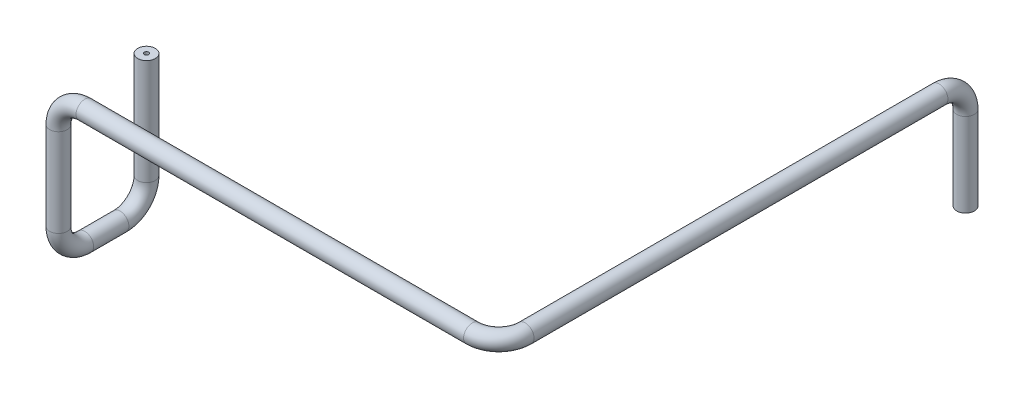
ISO-10303-21;
HEADER;
FILE_DESCRIPTION(('STEP AP214'),'2;1');
FILE_NAME('part.step','',(''),(''),'','','');
FILE_SCHEMA(('AUTOMOTIVE_DESIGN { 1 0 10303 214 1 1 1 1 }'));
ENDSEC;
DATA;
#1=APPLICATION_CONTEXT('core data for automotive mechanical design processes');
#2=APPLICATION_PROTOCOL_DEFINITION('international standard','automotive_design',2000,#1);
#3=PRODUCT_CONTEXT('',#1,'mechanical');
#4=PRODUCT('Part','Part','',(#3));
#5=PRODUCT_RELATED_PRODUCT_CATEGORY('part','',(#4));
#6=PRODUCT_DEFINITION_FORMATION('','',#4);
#7=PRODUCT_DEFINITION_CONTEXT('part definition',#1,'design');
#8=PRODUCT_DEFINITION('design','',#6,#7);
#9=PRODUCT_DEFINITION_SHAPE('','',#8);
#10=(LENGTH_UNIT() NAMED_UNIT(*) SI_UNIT(.MILLI.,.METRE.));
#11=(NAMED_UNIT(*) PLANE_ANGLE_UNIT() SI_UNIT($,.RADIAN.));
#12=(NAMED_UNIT(*) SI_UNIT($,.STERADIAN.) SOLID_ANGLE_UNIT());
#13=UNCERTAINTY_MEASURE_WITH_UNIT(LENGTH_MEASURE(1.E-05),#10,'distance_accuracy_value','');
#14=(GEOMETRIC_REPRESENTATION_CONTEXT(3) GLOBAL_UNCERTAINTY_ASSIGNED_CONTEXT((#13)) GLOBAL_UNIT_ASSIGNED_CONTEXT((#10,
#11,#12)) REPRESENTATION_CONTEXT('',''));
#15=CARTESIAN_POINT('',(0.,0.,0.));
#16=DIRECTION('',(0.,0.,1.));
#17=DIRECTION('',(1.,0.,0.));
#18=AXIS2_PLACEMENT_3D('',#15,#16,#17);
#19=CARTESIAN_POINT('',(20.,402.,236.));
#20=DIRECTION('',(0.,1.,0.));
#21=DIRECTION('',(1.,0.,0.));
#22=AXIS2_PLACEMENT_3D('',#19,#20,#21);
#23=PLANE('',#22);
#24=CARTESIAN_POINT('',(20.,402.,236.));
#25=DIRECTION('',(0.,1.,0.));
#26=DIRECTION('',(1.,0.,0.));
#27=AXIS2_PLACEMENT_3D('',#24,#25,#26);
#28=CIRCLE('',#27,0.5);
#29=CARTESIAN_POINT('',(20.5,402.,236.));
#30=VERTEX_POINT('',#29);
#31=EDGE_CURVE('E361',#30,#30,#28,.T.);
#32=ORIENTED_EDGE('',*,*,#31,.F.);
#33=EDGE_LOOP('',(#32));
#34=FACE_BOUND('',#33,.T.);
#35=CARTESIAN_POINT('',(20.,402.,236.));
#36=DIRECTION('',(0.,1.,0.));
#37=DIRECTION('',(0.,0.,1.));
#38=AXIS2_PLACEMENT_3D('',#35,#36,#37);
#39=CIRCLE('',#38,2.);
#40=CARTESIAN_POINT('',(20.,402.,238.));
#41=VERTEX_POINT('',#40);
#42=EDGE_CURVE('E75',#41,#41,#39,.T.);
#43=ORIENTED_EDGE('',*,*,#42,.T.);
#44=EDGE_LOOP('',(#43));
#45=FACE_BOUND('',#44,.T.);
#46=ADVANCED_FACE('F52',(#34,#45),#23,.T.);
#47=CARTESIAN_POINT('',(120.,379.,150.));
#48=DIRECTION('',(0.,1.,0.));
#49=DIRECTION('',(0.,0.,1.));
#50=AXIS2_PLACEMENT_3D('',#47,#48,#49);
#51=PLANE('',#50);
#52=CARTESIAN_POINT('',(120.,379.,150.));
#53=DIRECTION('',(0.,1.,0.));
#54=DIRECTION('',(0.,0.,1.));
#55=AXIS2_PLACEMENT_3D('',#52,#53,#54);
#56=CIRCLE('',#55,0.5);
#57=CARTESIAN_POINT('',(120.,379.,150.5));
#58=VERTEX_POINT('',#57);
#59=EDGE_CURVE('E73',#58,#58,#56,.T.);
#60=ORIENTED_EDGE('',*,*,#59,.T.);
#61=EDGE_LOOP('',(#60));
#62=FACE_BOUND('',#61,.T.);
#63=CARTESIAN_POINT('',(120.,379.,150.));
#64=DIRECTION('',(0.,1.,0.));
#65=DIRECTION('',(0.,0.,1.));
#66=AXIS2_PLACEMENT_3D('',#63,#64,#65);
#67=CIRCLE('',#66,2.);
#68=CARTESIAN_POINT('',(120.,379.,152.));
#69=VERTEX_POINT('',#68);
#70=EDGE_CURVE('E11',#69,#69,#67,.T.);
#71=ORIENTED_EDGE('',*,*,#70,.F.);
#72=EDGE_LOOP('',(#71));
#73=FACE_BOUND('',#72,.T.);
#74=ADVANCED_FACE('F180',(#62,#73),#51,.F.);
#75=CARTESIAN_POINT('',(20.,402.,236.));
#76=DIRECTION('',(0.,-1.,0.));
#77=DIRECTION('',(0.,0.,-1.));
#78=AXIS2_PLACEMENT_3D('',#75,#76,#77);
#79=CYLINDRICAL_SURFACE('',#78,2.);
#80=CARTESIAN_POINT('',(20.,378.,236.));
#81=DIRECTION('',(0.,-1.,0.));
#82=DIRECTION('',(0.,0.,-1.));
#83=AXIS2_PLACEMENT_3D('',#80,#81,#82);
#84=CIRCLE('',#83,2.);
#85=CARTESIAN_POINT('',(20.,378.,234.));
#86=VERTEX_POINT('',#85);
#87=EDGE_CURVE('E74',#86,#86,#84,.F.);
#88=ORIENTED_EDGE('',*,*,#87,.T.);
#89=EDGE_LOOP('',(#88));
#90=FACE_BOUND('',#89,.T.);
#91=ORIENTED_EDGE('',*,*,#42,.F.);
#92=EDGE_LOOP('',(#91));
#93=FACE_BOUND('',#92,.T.);
#94=ADVANCED_FACE('F179',(#90,#93),#79,.T.);
#95=CARTESIAN_POINT('',(20.,378.,242.));
#96=DIRECTION('',(-1.,0.,0.));
#97=DIRECTION('',(0.,0.,1.));
#98=AXIS2_PLACEMENT_3D('',#95,#96,#97);
#99=TOROIDAL_SURFACE('',#98,5.99999999999998,2.);
#100=CARTESIAN_POINT('',(20.,372.,242.));
#101=DIRECTION('',(0.,0.,-1.));
#102=DIRECTION('',(0.,1.,0.));
#103=AXIS2_PLACEMENT_3D('',#100,#101,#102);
#104=CIRCLE('',#103,2.);
#105=CARTESIAN_POINT('',(20.,370.,242.));
#106=VERTEX_POINT('',#105);
#107=EDGE_CURVE('E78',#106,#106,#104,.T.);
#108=CARTESIAN_POINT('',(20.,378.,242.));
#109=DIRECTION('',(-1.,0.,0.));
#110=DIRECTION('',(0.,0.,1.));
#111=AXIS2_PLACEMENT_3D('',#108,#109,#110);
#112=CIRCLE('',#111,7.99999999999998);
#113=EDGE_CURVE('',#86,#106,#112,.T.);
#114=ORIENTED_EDGE('',*,*,#87,.F.);
#115=ORIENTED_EDGE('',*,*,#107,.T.);
#116=ORIENTED_EDGE('',*,*,#113,.T.);
#117=ORIENTED_EDGE('',*,*,#113,.F.);
#118=EDGE_LOOP('',(#114,#116,#115,#117));
#119=FACE_BOUND('',#118,.T.);
#120=ADVANCED_FACE('F189',(#119),#99,.T.);
#121=CARTESIAN_POINT('',(20.,372.,242.));
#122=DIRECTION('',(0.,0.,1.));
#123=DIRECTION('',(1.,0.,0.));
#124=AXIS2_PLACEMENT_3D('',#121,#122,#123);
#125=CYLINDRICAL_SURFACE('',#124,2.);
#126=CARTESIAN_POINT('',(20.,372.,250.));
#127=DIRECTION('',(0.,0.,1.));
#128=DIRECTION('',(1.,0.,0.));
#129=AXIS2_PLACEMENT_3D('',#126,#127,#128);
#130=CIRCLE('',#129,2.);
#131=CARTESIAN_POINT('',(20.,370.,250.));
#132=VERTEX_POINT('',#131);
#133=EDGE_CURVE('E91',#132,#132,#130,.F.);
#134=ORIENTED_EDGE('',*,*,#133,.T.);
#135=EDGE_LOOP('',(#134));
#136=FACE_BOUND('',#135,.T.);
#137=ORIENTED_EDGE('',*,*,#107,.F.);
#138=EDGE_LOOP('',(#137));
#139=FACE_BOUND('',#138,.T.);
#140=ADVANCED_FACE('F187',(#136,#139),#125,.T.);
#141=CARTESIAN_POINT('',(20.,378.,250.));
#142=DIRECTION('',(-1.,0.,0.));
#143=DIRECTION('',(0.,0.,1.));
#144=AXIS2_PLACEMENT_3D('',#141,#142,#143);
#145=TOROIDAL_SURFACE('',#144,6.00000000000001,2.);
#146=CARTESIAN_POINT('',(20.,378.,256.));
#147=DIRECTION('',(0.,-1.,0.));
#148=DIRECTION('',(0.,0.,-1.));
#149=AXIS2_PLACEMENT_3D('',#146,#147,#148);
#150=CIRCLE('',#149,2.);
#151=CARTESIAN_POINT('',(20.,378.,258.));
#152=VERTEX_POINT('',#151);
#153=EDGE_CURVE('E96',#152,#152,#150,.T.);
#154=CARTESIAN_POINT('',(20.,378.,250.));
#155=DIRECTION('',(-1.,0.,0.));
#156=DIRECTION('',(0.,0.,1.));
#157=AXIS2_PLACEMENT_3D('',#154,#155,#156);
#158=CIRCLE('',#157,8.00000000000001);
#159=EDGE_CURVE('',#132,#152,#158,.T.);
#160=ORIENTED_EDGE('',*,*,#133,.F.);
#161=ORIENTED_EDGE('',*,*,#153,.T.);
#162=ORIENTED_EDGE('',*,*,#159,.T.);
#163=ORIENTED_EDGE('',*,*,#159,.F.);
#164=EDGE_LOOP('',(#160,#162,#161,#163));
#165=FACE_BOUND('',#164,.T.);
#166=ADVANCED_FACE('F193',(#165),#145,.T.);
#167=CARTESIAN_POINT('',(20.,378.,256.));
#168=DIRECTION('',(0.,1.,0.));
#169=DIRECTION('',(0.,0.,1.));
#170=AXIS2_PLACEMENT_3D('',#167,#168,#169);
#171=CYLINDRICAL_SURFACE('',#170,2.);
#172=CARTESIAN_POINT('',(20.,398.,256.));
#173=DIRECTION('',(0.,1.,0.));
#174=DIRECTION('',(0.,0.,1.));
#175=AXIS2_PLACEMENT_3D('',#172,#173,#174);
#176=CIRCLE('',#175,2.);
#177=CARTESIAN_POINT('',(18.,398.,256.));
#178=VERTEX_POINT('',#177);
#179=EDGE_CURVE('E97',#178,#178,#176,.F.);
#180=ORIENTED_EDGE('',*,*,#179,.T.);
#181=EDGE_LOOP('',(#180));
#182=FACE_BOUND('',#181,.T.);
#183=ORIENTED_EDGE('',*,*,#153,.F.);
#184=EDGE_LOOP('',(#183));
#185=FACE_BOUND('',#184,.T.);
#186=ADVANCED_FACE('F196',(#182,#185),#171,.T.);
#187=CARTESIAN_POINT('',(26.,398.,256.));
#188=DIRECTION('',(0.,0.,-1.));
#189=DIRECTION('',(-1.,0.,0.));
#190=AXIS2_PLACEMENT_3D('',#187,#188,#189);
#191=TOROIDAL_SURFACE('',#190,6.00000000000001,2.);
#192=CARTESIAN_POINT('',(26.,404.,256.));
#193=DIRECTION('',(-1.,0.,0.));
#194=DIRECTION('',(0.,-1.,0.));
#195=AXIS2_PLACEMENT_3D('',#192,#193,#194);
#196=CIRCLE('',#195,2.);
#197=CARTESIAN_POINT('',(26.,406.,256.));
#198=VERTEX_POINT('',#197);
#199=EDGE_CURVE('E105',#198,#198,#196,.T.);
#200=CARTESIAN_POINT('',(26.,398.,256.));
#201=DIRECTION('',(0.,0.,-1.));
#202=DIRECTION('',(-1.,0.,0.));
#203=AXIS2_PLACEMENT_3D('',#200,#201,#202);
#204=CIRCLE('',#203,8.00000000000001);
#205=EDGE_CURVE('',#178,#198,#204,.T.);
#206=ORIENTED_EDGE('',*,*,#179,.F.);
#207=ORIENTED_EDGE('',*,*,#199,.T.);
#208=ORIENTED_EDGE('',*,*,#205,.T.);
#209=ORIENTED_EDGE('',*,*,#205,.F.);
#210=EDGE_LOOP('',(#206,#208,#207,#209));
#211=FACE_BOUND('',#210,.T.);
#212=ADVANCED_FACE('F205',(#211),#191,.T.);
#213=CARTESIAN_POINT('',(26.,404.,256.));
#214=DIRECTION('',(1.,0.,0.));
#215=DIRECTION('',(0.,0.,-1.));
#216=AXIS2_PLACEMENT_3D('',#213,#214,#215);
#217=CYLINDRICAL_SURFACE('',#216,2.);
#218=CARTESIAN_POINT('',(114.,404.,256.));
#219=DIRECTION('',(1.,0.,0.));
#220=DIRECTION('',(0.,0.,-1.));
#221=AXIS2_PLACEMENT_3D('',#218,#219,#220);
#222=CIRCLE('',#221,2.);
#223=CARTESIAN_POINT('',(114.,404.,258.));
#224=VERTEX_POINT('',#223);
#225=EDGE_CURVE('E104',#224,#224,#222,.F.);
#226=ORIENTED_EDGE('',*,*,#225,.T.);
#227=EDGE_LOOP('',(#226));
#228=FACE_BOUND('',#227,.T.);
#229=ORIENTED_EDGE('',*,*,#199,.F.);
#230=EDGE_LOOP('',(#229));
#231=FACE_BOUND('',#230,.T.);
#232=ADVANCED_FACE('F125',(#228,#231),#217,.T.);
#233=CARTESIAN_POINT('',(114.,404.,250.));
#234=DIRECTION('',(0.,1.,0.));
#235=DIRECTION('',(0.,0.,1.));
#236=AXIS2_PLACEMENT_3D('',#233,#234,#235);
#237=TOROIDAL_SURFACE('',#236,6.00000000000001,2.);
#238=CARTESIAN_POINT('',(120.,404.,250.));
#239=DIRECTION('',(0.,0.,1.));
#240=DIRECTION('',(1.,0.,0.));
#241=AXIS2_PLACEMENT_3D('',#238,#239,#240);
#242=CIRCLE('',#241,2.);
#243=CARTESIAN_POINT('',(122.,404.,250.));
#244=VERTEX_POINT('',#243);
#245=EDGE_CURVE('E68',#244,#244,#242,.T.);
#246=CARTESIAN_POINT('',(114.,404.,250.));
#247=DIRECTION('',(0.,1.,0.));
#248=DIRECTION('',(0.,0.,1.));
#249=AXIS2_PLACEMENT_3D('',#246,#247,#248);
#250=CIRCLE('',#249,8.00000000000001);
#251=EDGE_CURVE('',#224,#244,#250,.T.);
#252=ORIENTED_EDGE('',*,*,#225,.F.);
#253=ORIENTED_EDGE('',*,*,#245,.T.);
#254=ORIENTED_EDGE('',*,*,#251,.T.);
#255=ORIENTED_EDGE('',*,*,#251,.F.);
#256=EDGE_LOOP('',(#252,#254,#253,#255));
#257=FACE_BOUND('',#256,.T.);
#258=ADVANCED_FACE('F109',(#257),#237,.T.);
#259=CARTESIAN_POINT('',(120.,404.,250.));
#260=DIRECTION('',(0.,0.,-1.));
#261=DIRECTION('',(-1.,0.,0.));
#262=AXIS2_PLACEMENT_3D('',#259,#260,#261);
#263=CYLINDRICAL_SURFACE('',#262,2.);
#264=CARTESIAN_POINT('',(120.,404.,156.));
#265=DIRECTION('',(0.,0.,-1.));
#266=DIRECTION('',(-1.,0.,0.));
#267=AXIS2_PLACEMENT_3D('',#264,#265,#266);
#268=CIRCLE('',#267,2.);
#269=CARTESIAN_POINT('',(120.,406.,156.));
#270=VERTEX_POINT('',#269);
#271=EDGE_CURVE('E63',#270,#270,#268,.F.);
#272=ORIENTED_EDGE('',*,*,#271,.T.);
#273=EDGE_LOOP('',(#272));
#274=FACE_BOUND('',#273,.T.);
#275=ORIENTED_EDGE('',*,*,#245,.F.);
#276=EDGE_LOOP('',(#275));
#277=FACE_BOUND('',#276,.T.);
#278=ADVANCED_FACE('F114',(#274,#277),#263,.T.);
#279=CARTESIAN_POINT('',(120.,398.,156.));
#280=DIRECTION('',(-1.,0.,0.));
#281=DIRECTION('',(0.,0.,1.));
#282=AXIS2_PLACEMENT_3D('',#279,#280,#281);
#283=TOROIDAL_SURFACE('',#282,6.00000000000006,2.);
#284=CARTESIAN_POINT('',(120.,398.000000000001,150.));
#285=DIRECTION('',(0.,1.,2.22167069604946E-13));
#286=DIRECTION('',(0.,-2.22167069604946E-13,1.));
#287=AXIS2_PLACEMENT_3D('',#284,#285,#286);
#288=CIRCLE('',#287,2.);
#289=CARTESIAN_POINT('',(120.,398.000000000002,148.));
#290=VERTEX_POINT('',#289);
#291=EDGE_CURVE('E58',#290,#290,#288,.T.);
#292=CARTESIAN_POINT('',(120.,398.,156.));
#293=DIRECTION('',(-1.,0.,0.));
#294=DIRECTION('',(0.,0.,1.));
#295=AXIS2_PLACEMENT_3D('',#292,#293,#294);
#296=CIRCLE('',#295,8.00000000000006);
#297=EDGE_CURVE('',#270,#290,#296,.T.);
#298=ORIENTED_EDGE('',*,*,#271,.F.);
#299=ORIENTED_EDGE('',*,*,#291,.T.);
#300=ORIENTED_EDGE('',*,*,#297,.T.);
#301=ORIENTED_EDGE('',*,*,#297,.F.);
#302=EDGE_LOOP('',(#298,#300,#299,#301));
#303=FACE_BOUND('',#302,.T.);
#304=ADVANCED_FACE('F113',(#303),#283,.T.);
#305=CARTESIAN_POINT('',(120.,398.,150.));
#306=DIRECTION('',(0.,-1.,0.));
#307=DIRECTION('',(0.,0.,-1.));
#308=AXIS2_PLACEMENT_3D('',#305,#306,#307);
#309=CYLINDRICAL_SURFACE('',#308,2.);
#310=ORIENTED_EDGE('',*,*,#70,.T.);
#311=EDGE_LOOP('',(#310));
#312=FACE_BOUND('',#311,.T.);
#313=ORIENTED_EDGE('',*,*,#291,.F.);
#314=EDGE_LOOP('',(#313));
#315=FACE_BOUND('',#314,.T.);
#316=ADVANCED_FACE('F54',(#312,#315),#309,.T.);
#317=CARTESIAN_POINT('',(20.,402.,236.));
#318=DIRECTION('',(0.,-1.,0.));
#319=DIRECTION('',(0.,0.,-1.));
#320=AXIS2_PLACEMENT_3D('',#317,#318,#319);
#321=CYLINDRICAL_SURFACE('',#320,0.5);
#322=CARTESIAN_POINT('',(20.,378.,236.));
#323=DIRECTION('',(0.,1.,0.));
#324=DIRECTION('',(1.,0.,0.));
#325=AXIS2_PLACEMENT_3D('',#322,#323,#324);
#326=CIRCLE('',#325,0.5);
#327=CARTESIAN_POINT('',(20.,378.,235.5));
#328=VERTEX_POINT('',#327);
#329=EDGE_CURVE('E365',#328,#328,#326,.T.);
#330=ORIENTED_EDGE('',*,*,#329,.F.);
#331=EDGE_LOOP('',(#330));
#332=FACE_BOUND('',#331,.T.);
#333=ORIENTED_EDGE('',*,*,#31,.T.);
#334=EDGE_LOOP('',(#333));
#335=FACE_BOUND('',#334,.T.);
#336=ADVANCED_FACE('F124',(#332,#335),#321,.F.);
#337=CARTESIAN_POINT('',(20.,378.,242.));
#338=DIRECTION('',(-1.,0.,0.));
#339=DIRECTION('',(0.,0.,1.));
#340=AXIS2_PLACEMENT_3D('',#337,#338,#339);
#341=TOROIDAL_SURFACE('',#340,5.99999999999998,0.5);
#342=CARTESIAN_POINT('',(20.,372.,242.));
#343=DIRECTION('',(0.,0.,-1.));
#344=DIRECTION('',(1.,0.,0.));
#345=AXIS2_PLACEMENT_3D('',#342,#343,#344);
#346=CIRCLE('',#345,0.5);
#347=CARTESIAN_POINT('',(20.,371.5,242.));
#348=VERTEX_POINT('',#347);
#349=EDGE_CURVE('E370',#348,#348,#346,.T.);
#350=CARTESIAN_POINT('',(20.,378.,242.));
#351=DIRECTION('',(-1.,0.,0.));
#352=DIRECTION('',(0.,0.,1.));
#353=AXIS2_PLACEMENT_3D('',#350,#351,#352);
#354=CIRCLE('',#353,6.49999999999998);
#355=EDGE_CURVE('',#328,#348,#354,.T.);
#356=ORIENTED_EDGE('',*,*,#329,.T.);
#357=ORIENTED_EDGE('',*,*,#349,.F.);
#358=ORIENTED_EDGE('',*,*,#355,.T.);
#359=ORIENTED_EDGE('',*,*,#355,.F.);
#360=EDGE_LOOP('',(#356,#358,#357,#359));
#361=FACE_BOUND('',#360,.T.);
#362=ADVANCED_FACE('F129',(#361),#341,.F.);
#363=CARTESIAN_POINT('',(20.,372.,242.));
#364=DIRECTION('',(0.,0.,1.));
#365=DIRECTION('',(1.,0.,0.));
#366=AXIS2_PLACEMENT_3D('',#363,#364,#365);
#367=CYLINDRICAL_SURFACE('',#366,0.5);
#368=CARTESIAN_POINT('',(20.,372.,250.));
#369=DIRECTION('',(0.,0.,-1.));
#370=DIRECTION('',(1.,0.,0.));
#371=AXIS2_PLACEMENT_3D('',#368,#369,#370);
#372=CIRCLE('',#371,0.5);
#373=CARTESIAN_POINT('',(20.,371.5,250.));
#374=VERTEX_POINT('',#373);
#375=EDGE_CURVE('E375',#374,#374,#372,.T.);
#376=ORIENTED_EDGE('',*,*,#375,.F.);
#377=EDGE_LOOP('',(#376));
#378=FACE_BOUND('',#377,.T.);
#379=ORIENTED_EDGE('',*,*,#349,.T.);
#380=EDGE_LOOP('',(#379));
#381=FACE_BOUND('',#380,.T.);
#382=ADVANCED_FACE('F136',(#378,#381),#367,.F.);
#383=CARTESIAN_POINT('',(20.,378.,250.));
#384=DIRECTION('',(-1.,0.,0.));
#385=DIRECTION('',(0.,0.,1.));
#386=AXIS2_PLACEMENT_3D('',#383,#384,#385);
#387=TOROIDAL_SURFACE('',#386,6.00000000000001,0.5);
#388=CARTESIAN_POINT('',(20.,378.,256.));
#389=DIRECTION('',(0.,-1.,0.));
#390=DIRECTION('',(1.,0.,0.));
#391=AXIS2_PLACEMENT_3D('',#388,#389,#390);
#392=CIRCLE('',#391,0.5);
#393=CARTESIAN_POINT('',(20.,378.,256.5));
#394=VERTEX_POINT('',#393);
#395=EDGE_CURVE('E374',#394,#394,#392,.T.);
#396=CARTESIAN_POINT('',(20.,378.,250.));
#397=DIRECTION('',(-1.,0.,0.));
#398=DIRECTION('',(0.,0.,1.));
#399=AXIS2_PLACEMENT_3D('',#396,#397,#398);
#400=CIRCLE('',#399,6.50000000000001);
#401=EDGE_CURVE('',#374,#394,#400,.T.);
#402=ORIENTED_EDGE('',*,*,#375,.T.);
#403=ORIENTED_EDGE('',*,*,#395,.F.);
#404=ORIENTED_EDGE('',*,*,#401,.T.);
#405=ORIENTED_EDGE('',*,*,#401,.F.);
#406=EDGE_LOOP('',(#402,#404,#403,#405));
#407=FACE_BOUND('',#406,.T.);
#408=ADVANCED_FACE('F145',(#407),#387,.F.);
#409=CARTESIAN_POINT('',(20.,378.,256.));
#410=DIRECTION('',(0.,1.,0.));
#411=DIRECTION('',(0.,0.,1.));
#412=AXIS2_PLACEMENT_3D('',#409,#410,#411);
#413=CYLINDRICAL_SURFACE('',#412,0.5);
#414=CARTESIAN_POINT('',(20.,398.,256.));
#415=DIRECTION('',(0.,-1.,0.));
#416=DIRECTION('',(1.,0.,0.));
#417=AXIS2_PLACEMENT_3D('',#414,#415,#416);
#418=CIRCLE('',#417,0.5);
#419=CARTESIAN_POINT('',(19.5,398.,256.));
#420=VERTEX_POINT('',#419);
#421=EDGE_CURVE('E378',#420,#420,#418,.T.);
#422=ORIENTED_EDGE('',*,*,#421,.F.);
#423=EDGE_LOOP('',(#422));
#424=FACE_BOUND('',#423,.T.);
#425=ORIENTED_EDGE('',*,*,#395,.T.);
#426=EDGE_LOOP('',(#425));
#427=FACE_BOUND('',#426,.T.);
#428=ADVANCED_FACE('F146',(#424,#427),#413,.F.);
#429=CARTESIAN_POINT('',(26.,398.,256.));
#430=DIRECTION('',(0.,0.,-1.));
#431=DIRECTION('',(-1.,0.,0.));
#432=AXIS2_PLACEMENT_3D('',#429,#430,#431);
#433=TOROIDAL_SURFACE('',#432,6.00000000000001,0.5);
#434=CARTESIAN_POINT('',(26.,404.,256.));
#435=DIRECTION('',(-1.,0.,0.));
#436=DIRECTION('',(0.,-1.,0.));
#437=AXIS2_PLACEMENT_3D('',#434,#435,#436);
#438=CIRCLE('',#437,0.5);
#439=CARTESIAN_POINT('',(26.,404.5,256.));
#440=VERTEX_POINT('',#439);
#441=EDGE_CURVE('E381',#440,#440,#438,.T.);
#442=CARTESIAN_POINT('',(26.,398.,256.));
#443=DIRECTION('',(0.,0.,-1.));
#444=DIRECTION('',(-1.,0.,0.));
#445=AXIS2_PLACEMENT_3D('',#442,#443,#444);
#446=CIRCLE('',#445,6.50000000000001);
#447=EDGE_CURVE('',#420,#440,#446,.T.);
#448=ORIENTED_EDGE('',*,*,#421,.T.);
#449=ORIENTED_EDGE('',*,*,#441,.F.);
#450=ORIENTED_EDGE('',*,*,#447,.T.);
#451=ORIENTED_EDGE('',*,*,#447,.F.);
#452=EDGE_LOOP('',(#448,#450,#449,#451));
#453=FACE_BOUND('',#452,.T.);
#454=ADVANCED_FACE('F155',(#453),#433,.F.);
#455=CARTESIAN_POINT('',(26.,404.,256.));
#456=DIRECTION('',(1.,0.,0.));
#457=DIRECTION('',(0.,0.,-1.));
#458=AXIS2_PLACEMENT_3D('',#455,#456,#457);
#459=CYLINDRICAL_SURFACE('',#458,0.5);
#460=CARTESIAN_POINT('',(114.,404.,256.));
#461=DIRECTION('',(-1.,0.,0.));
#462=DIRECTION('',(0.,-1.,0.));
#463=AXIS2_PLACEMENT_3D('',#460,#461,#462);
#464=CIRCLE('',#463,0.5);
#465=CARTESIAN_POINT('',(114.,404.,256.5));
#466=VERTEX_POINT('',#465);
#467=EDGE_CURVE('E383',#466,#466,#464,.T.);
#468=ORIENTED_EDGE('',*,*,#467,.F.);
#469=EDGE_LOOP('',(#468));
#470=FACE_BOUND('',#469,.T.);
#471=ORIENTED_EDGE('',*,*,#441,.T.);
#472=EDGE_LOOP('',(#471));
#473=FACE_BOUND('',#472,.T.);
#474=ADVANCED_FACE('F156',(#470,#473),#459,.F.);
#475=CARTESIAN_POINT('',(114.,404.,250.));
#476=DIRECTION('',(0.,1.,0.));
#477=DIRECTION('',(0.,0.,1.));
#478=AXIS2_PLACEMENT_3D('',#475,#476,#477);
#479=TOROIDAL_SURFACE('',#478,6.00000000000001,0.5);
#480=CARTESIAN_POINT('',(120.,404.,250.));
#481=DIRECTION('',(0.,0.,1.));
#482=DIRECTION('',(0.,-1.,0.));
#483=AXIS2_PLACEMENT_3D('',#480,#481,#482);
#484=CIRCLE('',#483,0.5);
#485=CARTESIAN_POINT('',(120.5,404.,250.));
#486=VERTEX_POINT('',#485);
#487=EDGE_CURVE('E390',#486,#486,#484,.T.);
#488=CARTESIAN_POINT('',(114.,404.,250.));
#489=DIRECTION('',(0.,1.,0.));
#490=DIRECTION('',(0.,0.,1.));
#491=AXIS2_PLACEMENT_3D('',#488,#489,#490);
#492=CIRCLE('',#491,6.50000000000001);
#493=EDGE_CURVE('',#466,#486,#492,.T.);
#494=ORIENTED_EDGE('',*,*,#467,.T.);
#495=ORIENTED_EDGE('',*,*,#487,.F.);
#496=ORIENTED_EDGE('',*,*,#493,.T.);
#497=ORIENTED_EDGE('',*,*,#493,.F.);
#498=EDGE_LOOP('',(#494,#496,#495,#497));
#499=FACE_BOUND('',#498,.T.);
#500=ADVANCED_FACE('F159',(#499),#479,.F.);
#501=CARTESIAN_POINT('',(120.,404.,250.));
#502=DIRECTION('',(0.,0.,-1.));
#503=DIRECTION('',(-1.,0.,0.));
#504=AXIS2_PLACEMENT_3D('',#501,#502,#503);
#505=CYLINDRICAL_SURFACE('',#504,0.5);
#506=CARTESIAN_POINT('',(120.,404.,156.));
#507=DIRECTION('',(0.,0.,1.));
#508=DIRECTION('',(0.,-1.,0.));
#509=AXIS2_PLACEMENT_3D('',#506,#507,#508);
#510=CIRCLE('',#509,0.5);
#511=CARTESIAN_POINT('',(120.,404.5,156.));
#512=VERTEX_POINT('',#511);
#513=EDGE_CURVE('E87',#512,#512,#510,.T.);
#514=ORIENTED_EDGE('',*,*,#513,.F.);
#515=EDGE_LOOP('',(#514));
#516=FACE_BOUND('',#515,.T.);
#517=ORIENTED_EDGE('',*,*,#487,.T.);
#518=EDGE_LOOP('',(#517));
#519=FACE_BOUND('',#518,.T.);
#520=ADVANCED_FACE('F163',(#516,#519),#505,.F.);
#521=CARTESIAN_POINT('',(120.,398.,156.));
#522=DIRECTION('',(-1.,0.,0.));
#523=DIRECTION('',(0.,0.,1.));
#524=AXIS2_PLACEMENT_3D('',#521,#522,#523);
#525=TOROIDAL_SURFACE('',#524,6.00000000000006,0.5);
#526=CARTESIAN_POINT('',(120.,398.000000000001,149.999999999997));
#527=DIRECTION('',(0.,1.,0.));
#528=DIRECTION('',(0.,0.,1.));
#529=AXIS2_PLACEMENT_3D('',#526,#527,#528);
#530=CIRCLE('',#529,0.5);
#531=CARTESIAN_POINT('',(120.,398.000000000002,149.5));
#532=VERTEX_POINT('',#531);
#533=EDGE_CURVE('E85',#532,#532,#530,.T.);
#534=CARTESIAN_POINT('',(120.,398.,156.));
#535=DIRECTION('',(-1.,0.,0.));
#536=DIRECTION('',(0.,0.,1.));
#537=AXIS2_PLACEMENT_3D('',#534,#535,#536);
#538=CIRCLE('',#537,6.50000000000006);
#539=EDGE_CURVE('',#512,#532,#538,.T.);
#540=ORIENTED_EDGE('',*,*,#513,.T.);
#541=ORIENTED_EDGE('',*,*,#533,.F.);
#542=ORIENTED_EDGE('',*,*,#539,.T.);
#543=ORIENTED_EDGE('',*,*,#539,.F.);
#544=EDGE_LOOP('',(#540,#542,#541,#543));
#545=FACE_BOUND('',#544,.T.);
#546=ADVANCED_FACE('F169',(#545),#525,.F.);
#547=CARTESIAN_POINT('',(120.,398.,150.));
#548=DIRECTION('',(0.,-1.,0.));
#549=DIRECTION('',(0.,0.,-1.));
#550=AXIS2_PLACEMENT_3D('',#547,#548,#549);
#551=CYLINDRICAL_SURFACE('',#550,0.5);
#552=ORIENTED_EDGE('',*,*,#59,.F.);
#553=EDGE_LOOP('',(#552));
#554=FACE_BOUND('',#553,.T.);
#555=ORIENTED_EDGE('',*,*,#533,.T.);
#556=EDGE_LOOP('',(#555));
#557=FACE_BOUND('',#556,.T.);
#558=ADVANCED_FACE('F171',(#554,#557),#551,.F.);
#559=CLOSED_SHELL('',(#46,#74,#94,#120,#140,#166,#186,#212,#232,#258,#278,#304,#316,#336,#362,
#382,#408,#428,#454,#474,#500,#520,#546,#558));
#560=MANIFOLD_SOLID_BREP('B2',#559);
#561=ADVANCED_BREP_SHAPE_REPRESENTATION('',(#18,#560),#14);
#562=SHAPE_DEFINITION_REPRESENTATION(#9,#561);
ENDSEC;
END-ISO-10303-21;
